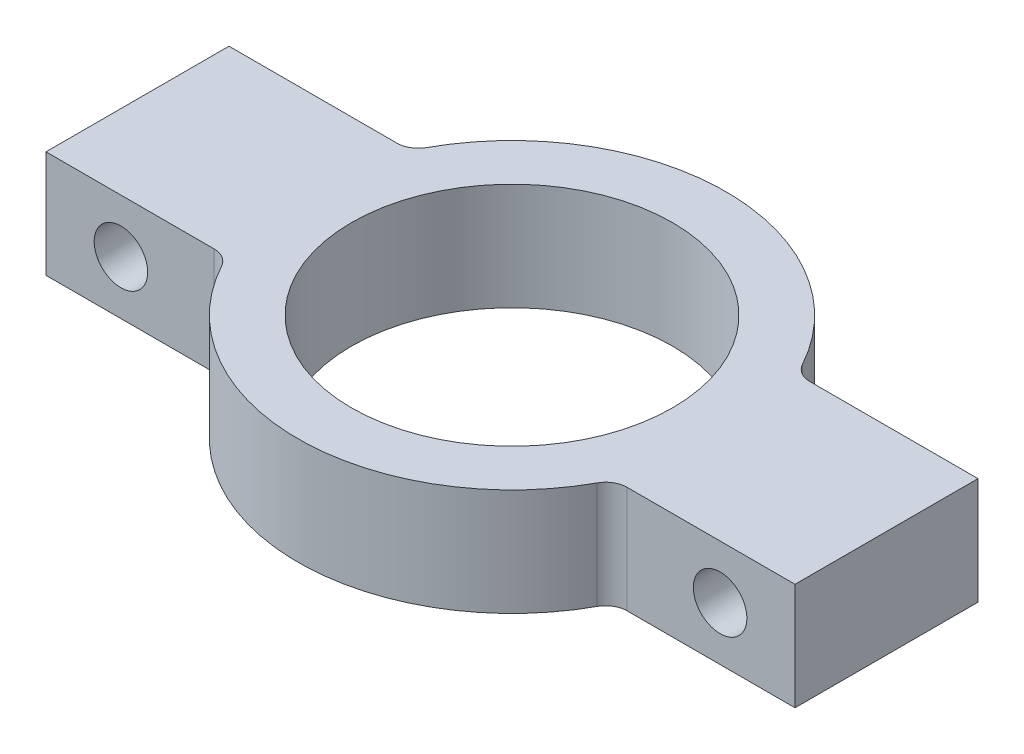
ISO-10303-21;
HEADER;
FILE_DESCRIPTION(('STEP AP214'),'2;1');
FILE_NAME('part.step','',(''),(''),'','','');
FILE_SCHEMA(('AUTOMOTIVE_DESIGN { 1 0 10303 214 1 1 1 1 }'));
ENDSEC;
DATA;
#1=APPLICATION_CONTEXT('core data for automotive mechanical design processes');
#2=APPLICATION_PROTOCOL_DEFINITION('international standard','automotive_design',2000,#1);
#3=PRODUCT_CONTEXT('',#1,'mechanical');
#4=PRODUCT('Part','Part','',(#3));
#5=PRODUCT_RELATED_PRODUCT_CATEGORY('part','',(#4));
#6=PRODUCT_DEFINITION_FORMATION('','',#4);
#7=PRODUCT_DEFINITION_CONTEXT('part definition',#1,'design');
#8=PRODUCT_DEFINITION('design','',#6,#7);
#9=PRODUCT_DEFINITION_SHAPE('','',#8);
#10=(LENGTH_UNIT() NAMED_UNIT(*) SI_UNIT(.MILLI.,.METRE.));
#11=(NAMED_UNIT(*) PLANE_ANGLE_UNIT() SI_UNIT($,.RADIAN.));
#12=(NAMED_UNIT(*) SI_UNIT($,.STERADIAN.) SOLID_ANGLE_UNIT());
#13=UNCERTAINTY_MEASURE_WITH_UNIT(LENGTH_MEASURE(1.E-05),#10,'distance_accuracy_value','');
#14=(GEOMETRIC_REPRESENTATION_CONTEXT(3) GLOBAL_UNCERTAINTY_ASSIGNED_CONTEXT((#13)) GLOBAL_UNIT_ASSIGNED_CONTEXT((#10,
#11,#12)) REPRESENTATION_CONTEXT('',''));
#15=CARTESIAN_POINT('',(0.,0.,0.));
#16=DIRECTION('',(0.,0.,1.));
#17=DIRECTION('',(1.,0.,0.));
#18=AXIS2_PLACEMENT_3D('',#15,#16,#17);
#19=CARTESIAN_POINT('',(0.,2.5,0.));
#20=DIRECTION('',(0.,-1.,0.));
#21=DIRECTION('',(0.,0.,-1.));
#22=AXIS2_PLACEMENT_3D('',#19,#20,#21);
#23=CYLINDRICAL_SURFACE('',#22,10.);
#24=CARTESIAN_POINT('',(0.,-2.5,0.));
#25=DIRECTION('',(0.,1.,0.));
#26=DIRECTION('',(0.,0.,1.));
#27=AXIS2_PLACEMENT_3D('',#24,#25,#26);
#28=CIRCLE('',#27,10.);
#29=CARTESIAN_POINT('',(-8.77517040874303,-2.5,4.79545454545455));
#30=VERTEX_POINT('',#29);
#31=CARTESIAN_POINT('',(8.77517040874304,-2.5,4.79545454545455));
#32=VERTEX_POINT('',#31);
#33=EDGE_CURVE('E171',#30,#32,#28,.T.);
#34=ORIENTED_EDGE('',*,*,#33,.T.);
#35=DIRECTION('',(0.,-1.,0.));
#36=VECTOR('',#35,1.);
#37=CARTESIAN_POINT('',(8.77517040874304,2.5,4.79545454545455));
#38=LINE('',#37,#36);
#39=CARTESIAN_POINT('',(8.77517040874304,2.5,4.79545454545455));
#40=VERTEX_POINT('',#39);
#41=EDGE_CURVE('E216',#32,#40,#38,.F.);
#42=ORIENTED_EDGE('',*,*,#41,.T.);
#43=CARTESIAN_POINT('',(0.,2.5,0.));
#44=DIRECTION('',(0.,1.,0.));
#45=DIRECTION('',(0.,0.,1.));
#46=AXIS2_PLACEMENT_3D('',#43,#44,#45);
#47=CIRCLE('',#46,10.);
#48=CARTESIAN_POINT('',(-8.77517040874303,2.5,4.79545454545455));
#49=VERTEX_POINT('',#48);
#50=EDGE_CURVE('E136',#49,#40,#47,.T.);
#51=ORIENTED_EDGE('',*,*,#50,.F.);
#52=DIRECTION('',(0.,-1.,0.));
#53=VECTOR('',#52,1.);
#54=CARTESIAN_POINT('',(-8.77517040874303,2.5,4.79545454545455));
#55=LINE('',#54,#53);
#56=EDGE_CURVE('E213',#49,#30,#55,.T.);
#57=ORIENTED_EDGE('',*,*,#56,.T.);
#58=EDGE_LOOP('',(#34,#42,#51,#57));
#59=FACE_BOUND('',#58,.T.);
#60=ADVANCED_FACE('F34',(#59),#23,.T.);
#61=CARTESIAN_POINT('',(0.,2.5,4.275));
#62=DIRECTION('',(0.,0.,-1.));
#63=DIRECTION('',(-1.,0.,0.));
#64=AXIS2_PLACEMENT_3D('',#61,#62,#63);
#65=PLANE('',#64);
#66=CARTESIAN_POINT('',(14.,0.,4.275));
#67=DIRECTION('',(0.,0.,-1.));
#68=DIRECTION('',(-1.,0.,0.));
#69=AXIS2_PLACEMENT_3D('',#66,#67,#68);
#70=CIRCLE('',#69,1.25);
#71=CARTESIAN_POINT('',(12.75,0.,4.275));
#72=VERTEX_POINT('',#71);
#73=EDGE_CURVE('E174',#72,#72,#70,.T.);
#74=ORIENTED_EDGE('',*,*,#73,.T.);
#75=EDGE_LOOP('',(#74));
#76=FACE_BOUND('',#75,.T.);
#77=DIRECTION('',(1.,0.,0.));
#78=VECTOR('',#77,1.);
#79=CARTESIAN_POINT('',(0.,2.5,4.275));
#80=LINE('',#79,#78);
#81=CARTESIAN_POINT('',(9.65268744961734,2.5,4.275));
#82=VERTEX_POINT('',#81);
#83=CARTESIAN_POINT('',(17.5,2.5,4.275));
#84=VERTEX_POINT('',#83);
#85=EDGE_CURVE('E123',#82,#84,#80,.T.);
#86=ORIENTED_EDGE('',*,*,#85,.F.);
#87=DIRECTION('',(0.,1.,0.));
#88=VECTOR('',#87,1.);
#89=CARTESIAN_POINT('',(9.65268744961734,-2.5,4.275));
#90=LINE('',#89,#88);
#91=CARTESIAN_POINT('',(9.65268744961734,-2.5,4.275));
#92=VERTEX_POINT('',#91);
#93=EDGE_CURVE('E211',#82,#92,#90,.F.);
#94=ORIENTED_EDGE('',*,*,#93,.T.);
#95=DIRECTION('',(1.,0.,0.));
#96=VECTOR('',#95,1.);
#97=CARTESIAN_POINT('',(0.,-2.5,4.275));
#98=LINE('',#97,#96);
#99=CARTESIAN_POINT('',(17.5,-2.5,4.275));
#100=VERTEX_POINT('',#99);
#101=EDGE_CURVE('E142',#92,#100,#98,.T.);
#102=ORIENTED_EDGE('',*,*,#101,.T.);
#103=DIRECTION('',(0.,-1.,0.));
#104=VECTOR('',#103,1.);
#105=CARTESIAN_POINT('',(17.5,2.5,4.275));
#106=LINE('',#105,#104);
#107=EDGE_CURVE('E139',#84,#100,#106,.T.);
#108=ORIENTED_EDGE('',*,*,#107,.F.);
#109=EDGE_LOOP('',(#86,#94,#102,#108));
#110=FACE_BOUND('',#109,.T.);
#111=ADVANCED_FACE('F140',(#76,#110),#65,.F.);
#112=CARTESIAN_POINT('',(17.5,2.5,0.));
#113=DIRECTION('',(1.,0.,0.));
#114=DIRECTION('',(0.,0.,-1.));
#115=AXIS2_PLACEMENT_3D('',#112,#113,#114);
#116=PLANE('',#115);
#117=DIRECTION('',(0.,0.,1.));
#118=VECTOR('',#117,1.);
#119=CARTESIAN_POINT('',(17.5,-2.5,0.));
#120=LINE('',#119,#118);
#121=CARTESIAN_POINT('',(17.5,-2.5,-4.275));
#122=VERTEX_POINT('',#121);
#123=EDGE_CURVE('E176',#122,#100,#120,.T.);
#124=ORIENTED_EDGE('',*,*,#123,.F.);
#125=DIRECTION('',(0.,-1.,0.));
#126=VECTOR('',#125,1.);
#127=CARTESIAN_POINT('',(17.5,2.5,-4.275));
#128=LINE('',#127,#126);
#129=CARTESIAN_POINT('',(17.5,2.5,-4.275));
#130=VERTEX_POINT('',#129);
#131=EDGE_CURVE('E147',#130,#122,#128,.T.);
#132=ORIENTED_EDGE('',*,*,#131,.F.);
#133=DIRECTION('',(0.,0.,1.));
#134=VECTOR('',#133,1.);
#135=CARTESIAN_POINT('',(17.5,2.5,0.));
#136=LINE('',#135,#134);
#137=EDGE_CURVE('E129',#130,#84,#136,.T.);
#138=ORIENTED_EDGE('',*,*,#137,.T.);
#139=ORIENTED_EDGE('',*,*,#107,.T.);
#140=EDGE_LOOP('',(#124,#132,#138,#139));
#141=FACE_BOUND('',#140,.T.);
#142=ADVANCED_FACE('F150',(#141),#116,.T.);
#143=CARTESIAN_POINT('',(0.,2.5,-4.275));
#144=DIRECTION('',(0.,0.,-1.));
#145=DIRECTION('',(-1.,0.,0.));
#146=AXIS2_PLACEMENT_3D('',#143,#144,#145);
#147=PLANE('',#146);
#148=CARTESIAN_POINT('',(14.,0.,-4.275));
#149=DIRECTION('',(0.,0.,-1.));
#150=DIRECTION('',(1.,0.,0.));
#151=AXIS2_PLACEMENT_3D('',#148,#149,#150);
#152=CIRCLE('',#151,1.25);
#153=CARTESIAN_POINT('',(15.25,0.,-4.275));
#154=VERTEX_POINT('',#153);
#155=EDGE_CURVE('E323',#154,#154,#152,.T.);
#156=ORIENTED_EDGE('',*,*,#155,.F.);
#157=EDGE_LOOP('',(#156));
#158=FACE_BOUND('',#157,.T.);
#159=DIRECTION('',(1.,0.,0.));
#160=VECTOR('',#159,1.);
#161=CARTESIAN_POINT('',(0.,-2.5,-4.275));
#162=LINE('',#161,#160);
#163=CARTESIAN_POINT('',(9.65268744961734,-2.5,-4.275));
#164=VERTEX_POINT('',#163);
#165=EDGE_CURVE('E178',#164,#122,#162,.T.);
#166=ORIENTED_EDGE('',*,*,#165,.F.);
#167=DIRECTION('',(0.,-1.,0.));
#168=VECTOR('',#167,1.);
#169=CARTESIAN_POINT('',(9.65268744961734,2.5,-4.275));
#170=LINE('',#169,#168);
#171=CARTESIAN_POINT('',(9.65268744961734,2.5,-4.275));
#172=VERTEX_POINT('',#171);
#173=EDGE_CURVE('E209',#164,#172,#170,.F.);
#174=ORIENTED_EDGE('',*,*,#173,.T.);
#175=DIRECTION('',(1.,0.,0.));
#176=VECTOR('',#175,1.);
#177=CARTESIAN_POINT('',(0.,2.5,-4.275));
#178=LINE('',#177,#176);
#179=EDGE_CURVE('E152',#172,#130,#178,.T.);
#180=ORIENTED_EDGE('',*,*,#179,.T.);
#181=ORIENTED_EDGE('',*,*,#131,.T.);
#182=EDGE_LOOP('',(#166,#174,#180,#181));
#183=FACE_BOUND('',#182,.T.);
#184=ADVANCED_FACE('F288',(#158,#183),#147,.T.);
#185=CARTESIAN_POINT('',(0.,2.5,0.));
#186=DIRECTION('',(0.,-1.,0.));
#187=DIRECTION('',(0.,0.,-1.));
#188=AXIS2_PLACEMENT_3D('',#185,#186,#187);
#189=CYLINDRICAL_SURFACE('',#188,10.);
#190=CARTESIAN_POINT('',(0.,-2.5,0.));
#191=DIRECTION('',(0.,1.,0.));
#192=DIRECTION('',(0.,0.,1.));
#193=AXIS2_PLACEMENT_3D('',#190,#191,#192);
#194=CIRCLE('',#193,10.);
#195=CARTESIAN_POINT('',(8.77517040874304,-2.5,-4.79545454545455));
#196=VERTEX_POINT('',#195);
#197=CARTESIAN_POINT('',(-8.77517040874303,-2.5,-4.79545454545455));
#198=VERTEX_POINT('',#197);
#199=EDGE_CURVE('E180',#196,#198,#194,.T.);
#200=ORIENTED_EDGE('',*,*,#199,.T.);
#201=DIRECTION('',(0.,-1.,0.));
#202=VECTOR('',#201,1.);
#203=CARTESIAN_POINT('',(-8.77517040874303,2.5,-4.79545454545455));
#204=LINE('',#203,#202);
#205=CARTESIAN_POINT('',(-8.77517040874303,2.5,-4.79545454545455));
#206=VERTEX_POINT('',#205);
#207=EDGE_CURVE('E207',#198,#206,#204,.F.);
#208=ORIENTED_EDGE('',*,*,#207,.T.);
#209=CARTESIAN_POINT('',(0.,2.5,0.));
#210=DIRECTION('',(0.,1.,0.));
#211=DIRECTION('',(0.,0.,1.));
#212=AXIS2_PLACEMENT_3D('',#209,#210,#211);
#213=CIRCLE('',#212,10.);
#214=CARTESIAN_POINT('',(8.77517040874304,2.5,-4.79545454545455));
#215=VERTEX_POINT('',#214);
#216=EDGE_CURVE('E154',#215,#206,#213,.T.);
#217=ORIENTED_EDGE('',*,*,#216,.F.);
#218=DIRECTION('',(0.,-1.,0.));
#219=VECTOR('',#218,1.);
#220=CARTESIAN_POINT('',(8.77517040874304,2.5,-4.79545454545455));
#221=LINE('',#220,#219);
#222=EDGE_CURVE('E204',#215,#196,#221,.T.);
#223=ORIENTED_EDGE('',*,*,#222,.T.);
#224=EDGE_LOOP('',(#200,#208,#217,#223));
#225=FACE_BOUND('',#224,.T.);
#226=ADVANCED_FACE('F282',(#225),#189,.T.);
#227=CARTESIAN_POINT('',(0.,2.5,-4.275));
#228=DIRECTION('',(0.,0.,-1.));
#229=DIRECTION('',(-1.,0.,0.));
#230=AXIS2_PLACEMENT_3D('',#227,#228,#229);
#231=PLANE('',#230);
#232=CARTESIAN_POINT('',(-14.,0.,-4.275));
#233=DIRECTION('',(0.,0.,-1.));
#234=DIRECTION('',(-1.,0.,0.));
#235=AXIS2_PLACEMENT_3D('',#232,#233,#234);
#236=CIRCLE('',#235,1.25);
#237=CARTESIAN_POINT('',(-15.25,0.,-4.275));
#238=VERTEX_POINT('',#237);
#239=EDGE_CURVE('E201',#238,#238,#236,.T.);
#240=ORIENTED_EDGE('',*,*,#239,.F.);
#241=EDGE_LOOP('',(#240));
#242=FACE_BOUND('',#241,.T.);
#243=DIRECTION('',(1.,0.,0.));
#244=VECTOR('',#243,1.);
#245=CARTESIAN_POINT('',(0.,2.5,-4.275));
#246=LINE('',#245,#244);
#247=CARTESIAN_POINT('',(-17.5,2.5,-4.275));
#248=VERTEX_POINT('',#247);
#249=CARTESIAN_POINT('',(-9.65268744961733,2.5,-4.275));
#250=VERTEX_POINT('',#249);
#251=EDGE_CURVE('E160',#248,#250,#246,.T.);
#252=ORIENTED_EDGE('',*,*,#251,.T.);
#253=DIRECTION('',(0.,-1.,0.));
#254=VECTOR('',#253,1.);
#255=CARTESIAN_POINT('',(-9.65268744961733,2.5,-4.275));
#256=LINE('',#255,#254);
#257=CARTESIAN_POINT('',(-9.65268744961733,-2.5,-4.275));
#258=VERTEX_POINT('',#257);
#259=EDGE_CURVE('E146',#250,#258,#256,.T.);
#260=ORIENTED_EDGE('',*,*,#259,.T.);
#261=DIRECTION('',(1.,0.,0.));
#262=VECTOR('',#261,1.);
#263=CARTESIAN_POINT('',(0.,-2.5,-4.275));
#264=LINE('',#263,#262);
#265=CARTESIAN_POINT('',(-17.5,-2.5,-4.275));
#266=VERTEX_POINT('',#265);
#267=EDGE_CURVE('E183',#266,#258,#264,.T.);
#268=ORIENTED_EDGE('',*,*,#267,.F.);
#269=DIRECTION('',(0.,-1.,0.));
#270=VECTOR('',#269,1.);
#271=CARTESIAN_POINT('',(-17.5,2.5,-4.275));
#272=LINE('',#271,#270);
#273=EDGE_CURVE('E195',#248,#266,#272,.T.);
#274=ORIENTED_EDGE('',*,*,#273,.F.);
#275=EDGE_LOOP('',(#252,#260,#268,#274));
#276=FACE_BOUND('',#275,.T.);
#277=ADVANCED_FACE('F271',(#242,#276),#231,.T.);
#278=CARTESIAN_POINT('',(-17.5,2.5,0.));
#279=DIRECTION('',(1.,0.,0.));
#280=DIRECTION('',(0.,0.,-1.));
#281=AXIS2_PLACEMENT_3D('',#278,#279,#280);
#282=PLANE('',#281);
#283=DIRECTION('',(0.,0.,1.));
#284=VECTOR('',#283,1.);
#285=CARTESIAN_POINT('',(-17.5,-2.5,0.));
#286=LINE('',#285,#284);
#287=CARTESIAN_POINT('',(-17.5,-2.5,4.275));
#288=VERTEX_POINT('',#287);
#289=EDGE_CURVE('E186',#266,#288,#286,.T.);
#290=ORIENTED_EDGE('',*,*,#289,.T.);
#291=DIRECTION('',(0.,-1.,0.));
#292=VECTOR('',#291,1.);
#293=CARTESIAN_POINT('',(-17.5,2.5,4.275));
#294=LINE('',#293,#292);
#295=CARTESIAN_POINT('',(-17.5,2.5,4.275));
#296=VERTEX_POINT('',#295);
#297=EDGE_CURVE('E170',#296,#288,#294,.T.);
#298=ORIENTED_EDGE('',*,*,#297,.F.);
#299=DIRECTION('',(0.,0.,1.));
#300=VECTOR('',#299,1.);
#301=CARTESIAN_POINT('',(-17.5,2.5,0.));
#302=LINE('',#301,#300);
#303=EDGE_CURVE('E163',#248,#296,#302,.T.);
#304=ORIENTED_EDGE('',*,*,#303,.F.);
#305=ORIENTED_EDGE('',*,*,#273,.T.);
#306=EDGE_LOOP('',(#290,#298,#304,#305));
#307=FACE_BOUND('',#306,.T.);
#308=ADVANCED_FACE('F277',(#307),#282,.F.);
#309=CARTESIAN_POINT('',(0.,2.5,4.275));
#310=DIRECTION('',(0.,0.,-1.));
#311=DIRECTION('',(-1.,0.,0.));
#312=AXIS2_PLACEMENT_3D('',#309,#310,#311);
#313=PLANE('',#312);
#314=CARTESIAN_POINT('',(-14.,0.,4.275));
#315=DIRECTION('',(0.,0.,-1.));
#316=DIRECTION('',(-1.,0.,0.));
#317=AXIS2_PLACEMENT_3D('',#314,#315,#316);
#318=CIRCLE('',#317,1.25);
#319=CARTESIAN_POINT('',(-15.25,0.,4.275));
#320=VERTEX_POINT('',#319);
#321=EDGE_CURVE('E198',#320,#320,#318,.T.);
#322=ORIENTED_EDGE('',*,*,#321,.T.);
#323=EDGE_LOOP('',(#322));
#324=FACE_BOUND('',#323,.T.);
#325=DIRECTION('',(1.,0.,0.));
#326=VECTOR('',#325,1.);
#327=CARTESIAN_POINT('',(0.,-2.5,4.275));
#328=LINE('',#327,#326);
#329=CARTESIAN_POINT('',(-9.65268744961733,-2.5,4.275));
#330=VERTEX_POINT('',#329);
#331=EDGE_CURVE('E188',#288,#330,#328,.T.);
#332=ORIENTED_EDGE('',*,*,#331,.T.);
#333=DIRECTION('',(0.,1.,0.));
#334=VECTOR('',#333,1.);
#335=CARTESIAN_POINT('',(-9.65268744961733,2.5,4.275));
#336=LINE('',#335,#334);
#337=CARTESIAN_POINT('',(-9.65268744961733,2.5,4.275));
#338=VERTEX_POINT('',#337);
#339=EDGE_CURVE('E49',#330,#338,#336,.T.);
#340=ORIENTED_EDGE('',*,*,#339,.T.);
#341=DIRECTION('',(1.,0.,0.));
#342=VECTOR('',#341,1.);
#343=CARTESIAN_POINT('',(0.,2.5,4.275));
#344=LINE('',#343,#342);
#345=EDGE_CURVE('E165',#296,#338,#344,.T.);
#346=ORIENTED_EDGE('',*,*,#345,.F.);
#347=ORIENTED_EDGE('',*,*,#297,.T.);
#348=EDGE_LOOP('',(#332,#340,#346,#347));
#349=FACE_BOUND('',#348,.T.);
#350=ADVANCED_FACE('F279',(#324,#349),#313,.F.);
#351=CARTESIAN_POINT('',(0.,2.5,0.));
#352=DIRECTION('',(0.,-1.,0.));
#353=DIRECTION('',(0.,0.,-1.));
#354=AXIS2_PLACEMENT_3D('',#351,#352,#353);
#355=CYLINDRICAL_SURFACE('',#354,7.5);
#356=CARTESIAN_POINT('',(0.,2.5,0.));
#357=DIRECTION('',(0.,1.,0.));
#358=DIRECTION('',(0.,0.,1.));
#359=AXIS2_PLACEMENT_3D('',#356,#357,#358);
#360=CIRCLE('',#359,7.5);
#361=CARTESIAN_POINT('',(0.,2.5,7.5));
#362=VERTEX_POINT('',#361);
#363=EDGE_CURVE('E167',#362,#362,#360,.T.);
#364=ORIENTED_EDGE('',*,*,#363,.T.);
#365=EDGE_LOOP('',(#364));
#366=FACE_BOUND('',#365,.T.);
#367=CARTESIAN_POINT('',(0.,-2.5,0.));
#368=DIRECTION('',(0.,1.,0.));
#369=DIRECTION('',(0.,0.,1.));
#370=AXIS2_PLACEMENT_3D('',#367,#368,#369);
#371=CIRCLE('',#370,7.5);
#372=CARTESIAN_POINT('',(0.,-2.5,7.5));
#373=VERTEX_POINT('',#372);
#374=EDGE_CURVE('E190',#373,#373,#371,.T.);
#375=ORIENTED_EDGE('',*,*,#374,.F.);
#376=EDGE_LOOP('',(#375));
#377=FACE_BOUND('',#376,.T.);
#378=ADVANCED_FACE('F306',(#366,#377),#355,.F.);
#379=CARTESIAN_POINT('',(0.,2.5,0.));
#380=DIRECTION('',(0.,1.,0.));
#381=DIRECTION('',(0.,0.,1.));
#382=AXIS2_PLACEMENT_3D('',#379,#380,#381);
#383=PLANE('',#382);
#384=ORIENTED_EDGE('',*,*,#345,.T.);
#385=CARTESIAN_POINT('',(-9.65268744961733,2.5,5.275));
#386=DIRECTION('',(0.,1.,0.));
#387=DIRECTION('',(0.,0.,1.));
#388=AXIS2_PLACEMENT_3D('',#385,#386,#387);
#389=CIRCLE('',#388,1.);
#390=EDGE_CURVE('E11',#338,#49,#389,.F.);
#391=ORIENTED_EDGE('',*,*,#390,.T.);
#392=ORIENTED_EDGE('',*,*,#50,.T.);
#393=CARTESIAN_POINT('',(9.65268744961734,2.5,5.275));
#394=DIRECTION('',(0.,1.,0.));
#395=DIRECTION('',(0.,0.,1.));
#396=AXIS2_PLACEMENT_3D('',#393,#394,#395);
#397=CIRCLE('',#396,1.);
#398=EDGE_CURVE('E132',#40,#82,#397,.F.);
#399=ORIENTED_EDGE('',*,*,#398,.T.);
#400=ORIENTED_EDGE('',*,*,#85,.T.);
#401=ORIENTED_EDGE('',*,*,#137,.F.);
#402=ORIENTED_EDGE('',*,*,#179,.F.);
#403=CARTESIAN_POINT('',(9.65268744961734,2.5,-5.275));
#404=DIRECTION('',(0.,1.,0.));
#405=DIRECTION('',(0.,0.,1.));
#406=AXIS2_PLACEMENT_3D('',#403,#404,#405);
#407=CIRCLE('',#406,1.);
#408=EDGE_CURVE('E225',#172,#215,#407,.F.);
#409=ORIENTED_EDGE('',*,*,#408,.T.);
#410=ORIENTED_EDGE('',*,*,#216,.T.);
#411=CARTESIAN_POINT('',(-9.65268744961733,2.5,-5.275));
#412=DIRECTION('',(0.,1.,0.));
#413=DIRECTION('',(0.,0.,1.));
#414=AXIS2_PLACEMENT_3D('',#411,#412,#413);
#415=CIRCLE('',#414,1.);
#416=EDGE_CURVE('E221',#206,#250,#415,.F.);
#417=ORIENTED_EDGE('',*,*,#416,.T.);
#418=ORIENTED_EDGE('',*,*,#251,.F.);
#419=ORIENTED_EDGE('',*,*,#303,.T.);
#420=EDGE_LOOP('',(#384,#391,#392,#399,#400,#401,#402,#409,#410,#417,#418,#419));
#421=FACE_BOUND('',#420,.T.);
#422=ORIENTED_EDGE('',*,*,#363,.F.);
#423=EDGE_LOOP('',(#422));
#424=FACE_BOUND('',#423,.T.);
#425=ADVANCED_FACE('F125',(#421,#424),#383,.T.);
#426=CARTESIAN_POINT('',(0.,-2.5,0.));
#427=DIRECTION('',(0.,1.,0.));
#428=DIRECTION('',(0.,0.,1.));
#429=AXIS2_PLACEMENT_3D('',#426,#427,#428);
#430=PLANE('',#429);
#431=ORIENTED_EDGE('',*,*,#33,.F.);
#432=CARTESIAN_POINT('',(-9.65268744961733,-2.5,5.275));
#433=DIRECTION('',(0.,1.,0.));
#434=DIRECTION('',(0.,0.,1.));
#435=AXIS2_PLACEMENT_3D('',#432,#433,#434);
#436=CIRCLE('',#435,1.);
#437=EDGE_CURVE('E42',#30,#330,#436,.T.);
#438=ORIENTED_EDGE('',*,*,#437,.T.);
#439=ORIENTED_EDGE('',*,*,#331,.F.);
#440=ORIENTED_EDGE('',*,*,#289,.F.);
#441=ORIENTED_EDGE('',*,*,#267,.T.);
#442=CARTESIAN_POINT('',(-9.65268744961733,-2.5,-5.275));
#443=DIRECTION('',(0.,1.,0.));
#444=DIRECTION('',(0.,0.,1.));
#445=AXIS2_PLACEMENT_3D('',#442,#443,#444);
#446=CIRCLE('',#445,1.);
#447=EDGE_CURVE('E219',#258,#198,#446,.T.);
#448=ORIENTED_EDGE('',*,*,#447,.T.);
#449=ORIENTED_EDGE('',*,*,#199,.F.);
#450=CARTESIAN_POINT('',(9.65268744961734,-2.5,-5.275));
#451=DIRECTION('',(0.,1.,0.));
#452=DIRECTION('',(0.,0.,1.));
#453=AXIS2_PLACEMENT_3D('',#450,#451,#452);
#454=CIRCLE('',#453,1.);
#455=EDGE_CURVE('E223',#196,#164,#454,.T.);
#456=ORIENTED_EDGE('',*,*,#455,.T.);
#457=ORIENTED_EDGE('',*,*,#165,.T.);
#458=ORIENTED_EDGE('',*,*,#123,.T.);
#459=ORIENTED_EDGE('',*,*,#101,.F.);
#460=CARTESIAN_POINT('',(9.65268744961734,-2.5,5.275));
#461=DIRECTION('',(0.,1.,0.));
#462=DIRECTION('',(0.,0.,1.));
#463=AXIS2_PLACEMENT_3D('',#460,#461,#462);
#464=CIRCLE('',#463,1.);
#465=EDGE_CURVE('E227',#92,#32,#464,.T.);
#466=ORIENTED_EDGE('',*,*,#465,.T.);
#467=EDGE_LOOP('',(#431,#438,#439,#440,#441,#448,#449,#456,#457,#458,#459,#466));
#468=FACE_BOUND('',#467,.T.);
#469=ORIENTED_EDGE('',*,*,#374,.T.);
#470=EDGE_LOOP('',(#469));
#471=FACE_BOUND('',#470,.T.);
#472=ADVANCED_FACE('F229',(#468,#471),#430,.F.);
#473=CARTESIAN_POINT('',(-14.,0.,5.725));
#474=DIRECTION('',(0.,0.,-1.));
#475=DIRECTION('',(-1.,0.,0.));
#476=AXIS2_PLACEMENT_3D('',#473,#474,#475);
#477=CYLINDRICAL_SURFACE('',#476,1.25);
#478=ORIENTED_EDGE('',*,*,#239,.T.);
#479=EDGE_LOOP('',(#478));
#480=FACE_BOUND('',#479,.T.);
#481=ORIENTED_EDGE('',*,*,#321,.F.);
#482=EDGE_LOOP('',(#481));
#483=FACE_BOUND('',#482,.T.);
#484=ADVANCED_FACE('F262',(#480,#483),#477,.F.);
#485=CARTESIAN_POINT('',(14.,0.,5.725));
#486=DIRECTION('',(0.,0.,-1.));
#487=DIRECTION('',(-1.,0.,0.));
#488=AXIS2_PLACEMENT_3D('',#485,#486,#487);
#489=CYLINDRICAL_SURFACE('',#488,1.25);
#490=ORIENTED_EDGE('',*,*,#155,.T.);
#491=EDGE_LOOP('',(#490));
#492=FACE_BOUND('',#491,.T.);
#493=ORIENTED_EDGE('',*,*,#73,.F.);
#494=EDGE_LOOP('',(#493));
#495=FACE_BOUND('',#494,.T.);
#496=ADVANCED_FACE('F257',(#492,#495),#489,.F.);
#497=CARTESIAN_POINT('',(-9.65268744961733,2.5,-5.275));
#498=DIRECTION('',(0.,-1.,0.));
#499=DIRECTION('',(0.,0.,-1.));
#500=AXIS2_PLACEMENT_3D('',#497,#498,#499);
#501=CYLINDRICAL_SURFACE('',#500,1.);
#502=ORIENTED_EDGE('',*,*,#416,.F.);
#503=ORIENTED_EDGE('',*,*,#207,.F.);
#504=ORIENTED_EDGE('',*,*,#447,.F.);
#505=ORIENTED_EDGE('',*,*,#259,.F.);
#506=EDGE_LOOP('',(#502,#503,#504,#505));
#507=FACE_BOUND('',#506,.T.);
#508=ADVANCED_FACE('F244',(#507),#501,.F.);
#509=CARTESIAN_POINT('',(9.65268744961734,2.5,-5.275));
#510=DIRECTION('',(0.,-1.,0.));
#511=DIRECTION('',(0.,0.,-1.));
#512=AXIS2_PLACEMENT_3D('',#509,#510,#511);
#513=CYLINDRICAL_SURFACE('',#512,1.);
#514=ORIENTED_EDGE('',*,*,#408,.F.);
#515=ORIENTED_EDGE('',*,*,#173,.F.);
#516=ORIENTED_EDGE('',*,*,#455,.F.);
#517=ORIENTED_EDGE('',*,*,#222,.F.);
#518=EDGE_LOOP('',(#514,#515,#516,#517));
#519=FACE_BOUND('',#518,.T.);
#520=ADVANCED_FACE('F238',(#519),#513,.F.);
#521=CARTESIAN_POINT('',(9.65268744961734,2.5,5.275));
#522=DIRECTION('',(0.,-1.,0.));
#523=DIRECTION('',(0.,0.,-1.));
#524=AXIS2_PLACEMENT_3D('',#521,#522,#523);
#525=CYLINDRICAL_SURFACE('',#524,1.);
#526=ORIENTED_EDGE('',*,*,#398,.F.);
#527=ORIENTED_EDGE('',*,*,#41,.F.);
#528=ORIENTED_EDGE('',*,*,#465,.F.);
#529=ORIENTED_EDGE('',*,*,#93,.F.);
#530=EDGE_LOOP('',(#526,#527,#528,#529));
#531=FACE_BOUND('',#530,.T.);
#532=ADVANCED_FACE('F236',(#531),#525,.F.);
#533=CARTESIAN_POINT('',(-9.65268744961733,2.5,5.275));
#534=DIRECTION('',(0.,-1.,0.));
#535=DIRECTION('',(0.,0.,-1.));
#536=AXIS2_PLACEMENT_3D('',#533,#534,#535);
#537=CYLINDRICAL_SURFACE('',#536,1.);
#538=ORIENTED_EDGE('',*,*,#390,.F.);
#539=ORIENTED_EDGE('',*,*,#339,.F.);
#540=ORIENTED_EDGE('',*,*,#437,.F.);
#541=ORIENTED_EDGE('',*,*,#56,.F.);
#542=EDGE_LOOP('',(#538,#539,#540,#541));
#543=FACE_BOUND('',#542,.T.);
#544=ADVANCED_FACE('F36',(#543),#537,.F.);
#545=CLOSED_SHELL('',(#60,#111,#142,#184,#226,#277,#308,#350,#378,#425,#472,#484,#496,#508,#520,
#532,#544));
#546=MANIFOLD_SOLID_BREP('B2',#545);
#547=ADVANCED_BREP_SHAPE_REPRESENTATION('',(#18,#546),#14);
#548=SHAPE_DEFINITION_REPRESENTATION(#9,#547);
ENDSEC;
END-ISO-10303-21;
